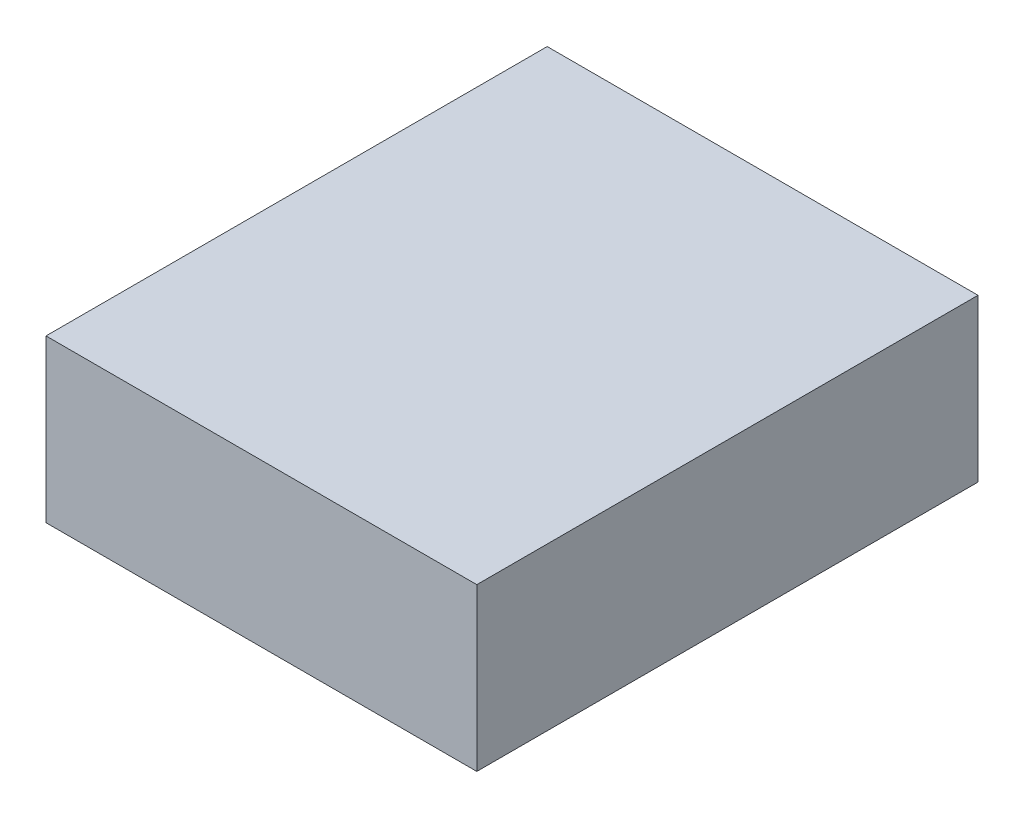
ISO-10303-21;
HEADER;
FILE_DESCRIPTION(('STEP AP214'),'2;1');
FILE_NAME('part.step','',(''),(''),'','','');
FILE_SCHEMA(('AUTOMOTIVE_DESIGN { 1 0 10303 214 1 1 1 1 }'));
ENDSEC;
DATA;
#1=APPLICATION_CONTEXT('core data for automotive mechanical design processes');
#2=APPLICATION_PROTOCOL_DEFINITION('international standard','automotive_design',2000,#1);
#3=PRODUCT_CONTEXT('',#1,'mechanical');
#4=PRODUCT('Part','Part','',(#3));
#5=PRODUCT_RELATED_PRODUCT_CATEGORY('part','',(#4));
#6=PRODUCT_DEFINITION_FORMATION('','',#4);
#7=PRODUCT_DEFINITION_CONTEXT('part definition',#1,'design');
#8=PRODUCT_DEFINITION('design','',#6,#7);
#9=PRODUCT_DEFINITION_SHAPE('','',#8);
#10=(LENGTH_UNIT() NAMED_UNIT(*) SI_UNIT(.MILLI.,.METRE.));
#11=(NAMED_UNIT(*) PLANE_ANGLE_UNIT() SI_UNIT($,.RADIAN.));
#12=(NAMED_UNIT(*) SI_UNIT($,.STERADIAN.) SOLID_ANGLE_UNIT());
#13=UNCERTAINTY_MEASURE_WITH_UNIT(LENGTH_MEASURE(1.E-05),#10,'distance_accuracy_value','');
#14=(GEOMETRIC_REPRESENTATION_CONTEXT(3) GLOBAL_UNCERTAINTY_ASSIGNED_CONTEXT((#13)) GLOBAL_UNIT_ASSIGNED_CONTEXT((#10,
#11,#12)) REPRESENTATION_CONTEXT('',''));
#15=CARTESIAN_POINT('',(0.,0.,0.));
#16=DIRECTION('',(0.,0.,1.));
#17=DIRECTION('',(1.,0.,0.));
#18=AXIS2_PLACEMENT_3D('',#15,#16,#17);
#19=CARTESIAN_POINT('',(0.65499996,-0.24597614,0.));
#20=DIRECTION('',(0.,-1.,0.));
#21=DIRECTION('',(0.,0.,-1.));
#22=AXIS2_PLACEMENT_3D('',#19,#20,#21);
#23=PLANE('',#22);
#24=DIRECTION('',(0.,0.,1.));
#25=VECTOR('',#24,1.);
#26=CARTESIAN_POINT('',(-0.65499996,-0.24597614,0.));
#27=LINE('',#26,#25);
#28=CARTESIAN_POINT('',(-0.65499996,-0.24597614,0.));
#29=VERTEX_POINT('',#28);
#30=CARTESIAN_POINT('',(-0.65499996,-0.24597614,1.524));
#31=VERTEX_POINT('',#30);
#32=EDGE_CURVE('E20',#29,#31,#27,.T.);
#33=ORIENTED_EDGE('',*,*,#32,.F.);
#34=DIRECTION('',(1.,0.,0.));
#35=VECTOR('',#34,1.);
#36=CARTESIAN_POINT('',(-0.65499996,-0.24597614,0.));
#37=LINE('',#36,#35);
#38=CARTESIAN_POINT('',(0.65499996,-0.24597614,0.));
#39=VERTEX_POINT('',#38);
#40=EDGE_CURVE('E80',#29,#39,#37,.T.);
#41=ORIENTED_EDGE('',*,*,#40,.T.);
#42=DIRECTION('',(0.,0.,-1.));
#43=VECTOR('',#42,1.);
#44=CARTESIAN_POINT('',(0.65499996,-0.24597614,0.));
#45=LINE('',#44,#43);
#46=CARTESIAN_POINT('',(0.65499996,-0.24597614,1.524));
#47=VERTEX_POINT('',#46);
#48=EDGE_CURVE('E68',#47,#39,#45,.T.);
#49=ORIENTED_EDGE('',*,*,#48,.F.);
#50=DIRECTION('',(1.,0.,0.));
#51=VECTOR('',#50,1.);
#52=CARTESIAN_POINT('',(-0.65499996,-0.24597614,1.524));
#53=LINE('',#52,#51);
#54=EDGE_CURVE('E56',#31,#47,#53,.T.);
#55=ORIENTED_EDGE('',*,*,#54,.F.);
#56=EDGE_LOOP('',(#33,#41,#49,#55));
#57=FACE_BOUND('',#56,.T.);
#58=ADVANCED_FACE('F17',(#57),#23,.T.);
#59=CARTESIAN_POINT('',(-0.65499996,-0.24597614,0.));
#60=DIRECTION('',(-1.,0.,0.));
#61=DIRECTION('',(0.,0.,1.));
#62=AXIS2_PLACEMENT_3D('',#59,#60,#61);
#63=PLANE('',#62);
#64=DIRECTION('',(0.,0.,1.));
#65=VECTOR('',#64,1.);
#66=CARTESIAN_POINT('',(-0.65499996,0.24597614,0.));
#67=LINE('',#66,#65);
#68=CARTESIAN_POINT('',(-0.65499996,0.24597614,0.));
#69=VERTEX_POINT('',#68);
#70=CARTESIAN_POINT('',(-0.65499996,0.24597614,1.524));
#71=VERTEX_POINT('',#70);
#72=EDGE_CURVE('E83',#69,#71,#67,.T.);
#73=ORIENTED_EDGE('',*,*,#72,.F.);
#74=DIRECTION('',(0.,1.,0.));
#75=VECTOR('',#74,1.);
#76=CARTESIAN_POINT('',(-0.65499996,0.24597614,0.));
#77=LINE('',#76,#75);
#78=EDGE_CURVE('E65',#69,#29,#77,.F.);
#79=ORIENTED_EDGE('',*,*,#78,.T.);
#80=ORIENTED_EDGE('',*,*,#32,.T.);
#81=DIRECTION('',(0.,1.,0.));
#82=VECTOR('',#81,1.);
#83=CARTESIAN_POINT('',(-0.65499996,0.24597614,1.524));
#84=LINE('',#83,#82);
#85=EDGE_CURVE('E62',#71,#31,#84,.F.);
#86=ORIENTED_EDGE('',*,*,#85,.F.);
#87=EDGE_LOOP('',(#73,#79,#80,#86));
#88=FACE_BOUND('',#87,.T.);
#89=ADVANCED_FACE('F61',(#88),#63,.T.);
#90=CARTESIAN_POINT('',(-0.65499996,0.24597614,1.524));
#91=DIRECTION('',(0.,0.,1.));
#92=DIRECTION('',(1.,0.,0.));
#93=AXIS2_PLACEMENT_3D('',#90,#91,#92);
#94=PLANE('',#93);
#95=DIRECTION('',(0.,1.,0.));
#96=VECTOR('',#95,1.);
#97=CARTESIAN_POINT('',(0.65499996,0.24597614,1.524));
#98=LINE('',#97,#96);
#99=CARTESIAN_POINT('',(0.65499996,0.24597614,1.524));
#100=VERTEX_POINT('',#99);
#101=EDGE_CURVE('E70',#100,#47,#98,.F.);
#102=ORIENTED_EDGE('',*,*,#101,.F.);
#103=DIRECTION('',(1.,0.,0.));
#104=VECTOR('',#103,1.);
#105=CARTESIAN_POINT('',(-0.65499996,0.24597614,1.524));
#106=LINE('',#105,#104);
#107=EDGE_CURVE('E74',#71,#100,#106,.T.);
#108=ORIENTED_EDGE('',*,*,#107,.F.);
#109=ORIENTED_EDGE('',*,*,#85,.T.);
#110=ORIENTED_EDGE('',*,*,#54,.T.);
#111=EDGE_LOOP('',(#102,#108,#109,#110));
#112=FACE_BOUND('',#111,.T.);
#113=ADVANCED_FACE('F72',(#112),#94,.T.);
#114=CARTESIAN_POINT('',(0.65499996,0.24597614,0.));
#115=DIRECTION('',(1.,0.,0.));
#116=DIRECTION('',(0.,0.,-1.));
#117=AXIS2_PLACEMENT_3D('',#114,#115,#116);
#118=PLANE('',#117);
#119=ORIENTED_EDGE('',*,*,#48,.T.);
#120=DIRECTION('',(0.,1.,0.));
#121=VECTOR('',#120,1.);
#122=CARTESIAN_POINT('',(0.65499996,0.24597614,0.));
#123=LINE('',#122,#121);
#124=CARTESIAN_POINT('',(0.65499996,0.24597614,0.));
#125=VERTEX_POINT('',#124);
#126=EDGE_CURVE('E35',#39,#125,#123,.T.);
#127=ORIENTED_EDGE('',*,*,#126,.T.);
#128=DIRECTION('',(0.,0.,1.));
#129=VECTOR('',#128,1.);
#130=CARTESIAN_POINT('',(0.65499996,0.24597614,0.));
#131=LINE('',#130,#129);
#132=EDGE_CURVE('E26',#100,#125,#131,.F.);
#133=ORIENTED_EDGE('',*,*,#132,.F.);
#134=ORIENTED_EDGE('',*,*,#101,.T.);
#135=EDGE_LOOP('',(#119,#127,#133,#134));
#136=FACE_BOUND('',#135,.T.);
#137=ADVANCED_FACE('F89',(#136),#118,.T.);
#138=CARTESIAN_POINT('',(-0.65499996,0.24597614,0.));
#139=DIRECTION('',(0.,0.,1.));
#140=DIRECTION('',(1.,0.,0.));
#141=AXIS2_PLACEMENT_3D('',#138,#139,#140);
#142=PLANE('',#141);
#143=ORIENTED_EDGE('',*,*,#126,.F.);
#144=ORIENTED_EDGE('',*,*,#40,.F.);
#145=ORIENTED_EDGE('',*,*,#78,.F.);
#146=DIRECTION('',(1.,0.,0.));
#147=VECTOR('',#146,1.);
#148=CARTESIAN_POINT('',(-0.65499996,0.24597614,0.));
#149=LINE('',#148,#147);
#150=EDGE_CURVE('E11',#125,#69,#149,.F.);
#151=ORIENTED_EDGE('',*,*,#150,.F.);
#152=EDGE_LOOP('',(#143,#144,#145,#151));
#153=FACE_BOUND('',#152,.T.);
#154=ADVANCED_FACE('F91',(#153),#142,.F.);
#155=CARTESIAN_POINT('',(-0.65499996,0.24597614,0.));
#156=DIRECTION('',(0.,1.,0.));
#157=DIRECTION('',(0.,0.,1.));
#158=AXIS2_PLACEMENT_3D('',#155,#156,#157);
#159=PLANE('',#158);
#160=ORIENTED_EDGE('',*,*,#132,.T.);
#161=ORIENTED_EDGE('',*,*,#150,.T.);
#162=ORIENTED_EDGE('',*,*,#72,.T.);
#163=ORIENTED_EDGE('',*,*,#107,.T.);
#164=EDGE_LOOP('',(#160,#161,#162,#163));
#165=FACE_BOUND('',#164,.T.);
#166=ADVANCED_FACE('F88',(#165),#159,.T.);
#167=CLOSED_SHELL('',(#58,#89,#113,#137,#154,#166));
#168=MANIFOLD_SOLID_BREP('B1',#167);
#169=ADVANCED_BREP_SHAPE_REPRESENTATION('',(#18,#168),#14);
#170=SHAPE_DEFINITION_REPRESENTATION(#9,#169);
ENDSEC;
END-ISO-10303-21;
